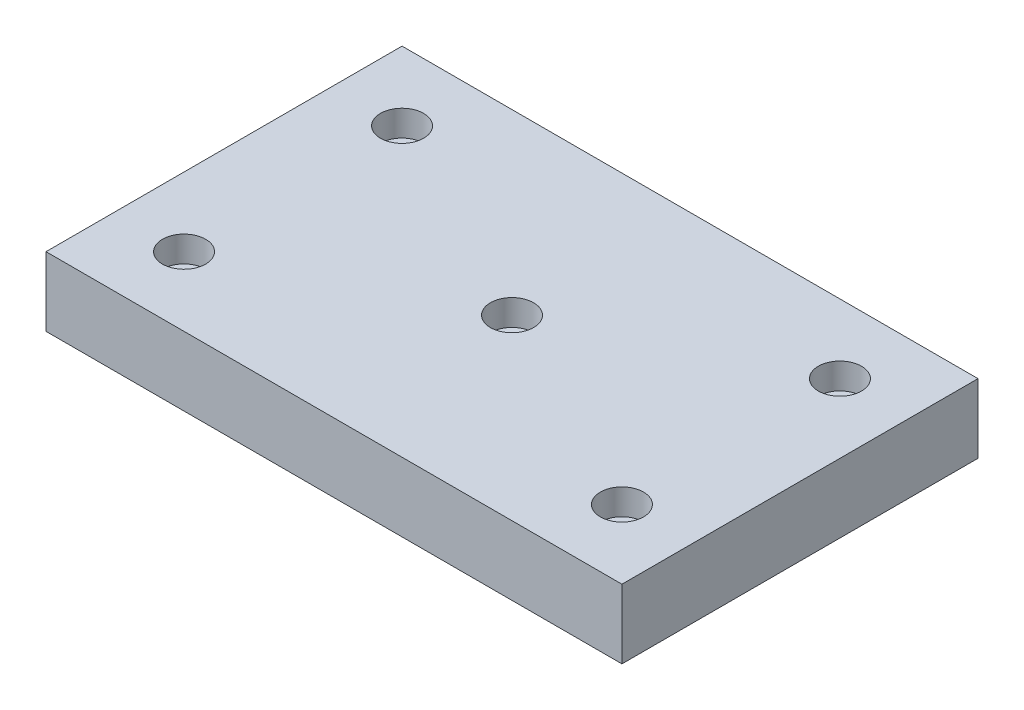
ISO-10303-21;
HEADER;
FILE_DESCRIPTION(('STEP AP214'),'2;1');
FILE_NAME('part.step','',(''),(''),'','','');
FILE_SCHEMA(('AUTOMOTIVE_DESIGN { 1 0 10303 214 1 1 1 1 }'));
ENDSEC;
DATA;
#1=APPLICATION_CONTEXT('core data for automotive mechanical design processes');
#2=APPLICATION_PROTOCOL_DEFINITION('international standard','automotive_design',2000,#1);
#3=PRODUCT_CONTEXT('',#1,'mechanical');
#4=PRODUCT('Part','Part','',(#3));
#5=PRODUCT_RELATED_PRODUCT_CATEGORY('part','',(#4));
#6=PRODUCT_DEFINITION_FORMATION('','',#4);
#7=PRODUCT_DEFINITION_CONTEXT('part definition',#1,'design');
#8=PRODUCT_DEFINITION('design','',#6,#7);
#9=PRODUCT_DEFINITION_SHAPE('','',#8);
#10=(LENGTH_UNIT() NAMED_UNIT(*) SI_UNIT(.MILLI.,.METRE.));
#11=(NAMED_UNIT(*) PLANE_ANGLE_UNIT() SI_UNIT($,.RADIAN.));
#12=(NAMED_UNIT(*) SI_UNIT($,.STERADIAN.) SOLID_ANGLE_UNIT());
#13=UNCERTAINTY_MEASURE_WITH_UNIT(LENGTH_MEASURE(1.E-05),#10,'distance_accuracy_value','');
#14=(GEOMETRIC_REPRESENTATION_CONTEXT(3) GLOBAL_UNCERTAINTY_ASSIGNED_CONTEXT((#13)) GLOBAL_UNIT_ASSIGNED_CONTEXT((#10,
#11,#12)) REPRESENTATION_CONTEXT('',''));
#15=CARTESIAN_POINT('',(0.,0.,0.));
#16=DIRECTION('',(0.,0.,1.));
#17=DIRECTION('',(1.,0.,0.));
#18=AXIS2_PLACEMENT_3D('',#15,#16,#17);
#19=CARTESIAN_POINT('',(105.966303111985,25.4,65.5095196554923));
#20=DIRECTION('',(-1.,0.,0.));
#21=DIRECTION('',(0.,0.,1.));
#22=AXIS2_PLACEMENT_3D('',#19,#20,#21);
#23=PLANE('',#22);
#24=DIRECTION('',(0.,0.,-1.));
#25=VECTOR('',#24,1.);
#26=CARTESIAN_POINT('',(105.966303111985,0.,65.5095196554923));
#27=LINE('',#26,#25);
#28=CARTESIAN_POINT('',(105.966303111985,0.,65.5095196554923));
#29=VERTEX_POINT('',#28);
#30=CARTESIAN_POINT('',(105.966303111985,0.,-65.5095196554923));
#31=VERTEX_POINT('',#30);
#32=EDGE_CURVE('E97',#29,#31,#27,.T.);
#33=ORIENTED_EDGE('',*,*,#32,.T.);
#34=DIRECTION('',(0.,-1.,0.));
#35=VECTOR('',#34,1.);
#36=CARTESIAN_POINT('',(105.966303111985,25.4,-65.5095196554923));
#37=LINE('',#36,#35);
#38=CARTESIAN_POINT('',(105.966303111985,25.4,-65.5095196554923));
#39=VERTEX_POINT('',#38);
#40=EDGE_CURVE('E11',#39,#31,#37,.T.);
#41=ORIENTED_EDGE('',*,*,#40,.F.);
#42=DIRECTION('',(0.,0.,-1.));
#43=VECTOR('',#42,1.);
#44=CARTESIAN_POINT('',(105.966303111985,25.4,65.5095196554923));
#45=LINE('',#44,#43);
#46=CARTESIAN_POINT('',(105.966303111985,25.4,65.5095196554923));
#47=VERTEX_POINT('',#46);
#48=EDGE_CURVE('E85',#47,#39,#45,.T.);
#49=ORIENTED_EDGE('',*,*,#48,.F.);
#50=DIRECTION('',(0.,-1.,0.));
#51=VECTOR('',#50,1.);
#52=CARTESIAN_POINT('',(105.966303111985,25.4,65.5095196554923));
#53=LINE('',#52,#51);
#54=EDGE_CURVE('E93',#47,#29,#53,.T.);
#55=ORIENTED_EDGE('',*,*,#54,.T.);
#56=EDGE_LOOP('',(#33,#41,#49,#55));
#57=FACE_BOUND('',#56,.T.);
#58=ADVANCED_FACE('F34',(#57),#23,.F.);
#59=CARTESIAN_POINT('',(-105.966303111985,25.4,-65.5095196554923));
#60=DIRECTION('',(0.,0.,1.));
#61=DIRECTION('',(1.,0.,0.));
#62=AXIS2_PLACEMENT_3D('',#59,#60,#61);
#63=PLANE('',#62);
#64=DIRECTION('',(-1.,0.,0.));
#65=VECTOR('',#64,1.);
#66=CARTESIAN_POINT('',(-105.966303111985,0.,-65.5095196554923));
#67=LINE('',#66,#65);
#68=CARTESIAN_POINT('',(-105.966303111985,0.,-65.5095196554923));
#69=VERTEX_POINT('',#68);
#70=EDGE_CURVE('E89',#31,#69,#67,.T.);
#71=ORIENTED_EDGE('',*,*,#70,.T.);
#72=DIRECTION('',(0.,-1.,0.));
#73=VECTOR('',#72,1.);
#74=CARTESIAN_POINT('',(-105.966303111985,25.4,-65.5095196554923));
#75=LINE('',#74,#73);
#76=CARTESIAN_POINT('',(-105.966303111985,25.4,-65.5095196554923));
#77=VERTEX_POINT('',#76);
#78=EDGE_CURVE('E42',#77,#69,#75,.T.);
#79=ORIENTED_EDGE('',*,*,#78,.F.);
#80=DIRECTION('',(-1.,0.,0.));
#81=VECTOR('',#80,1.);
#82=CARTESIAN_POINT('',(-105.966303111985,25.4,-65.5095196554923));
#83=LINE('',#82,#81);
#84=EDGE_CURVE('E80',#39,#77,#83,.T.);
#85=ORIENTED_EDGE('',*,*,#84,.F.);
#86=ORIENTED_EDGE('',*,*,#40,.T.);
#87=EDGE_LOOP('',(#71,#79,#85,#86));
#88=FACE_BOUND('',#87,.T.);
#89=ADVANCED_FACE('F88',(#88),#63,.F.);
#90=CARTESIAN_POINT('',(-105.966303111985,25.4,65.5095196554923));
#91=DIRECTION('',(1.,0.,0.));
#92=DIRECTION('',(0.,0.,-1.));
#93=AXIS2_PLACEMENT_3D('',#90,#91,#92);
#94=PLANE('',#93);
#95=DIRECTION('',(0.,0.,1.));
#96=VECTOR('',#95,1.);
#97=CARTESIAN_POINT('',(-105.966303111985,0.,65.5095196554923));
#98=LINE('',#97,#96);
#99=CARTESIAN_POINT('',(-105.966303111985,0.,65.5095196554923));
#100=VERTEX_POINT('',#99);
#101=EDGE_CURVE('E67',#69,#100,#98,.T.);
#102=ORIENTED_EDGE('',*,*,#101,.T.);
#103=DIRECTION('',(0.,-1.,0.));
#104=VECTOR('',#103,1.);
#105=CARTESIAN_POINT('',(-105.966303111985,25.4,65.5095196554923));
#106=LINE('',#105,#104);
#107=CARTESIAN_POINT('',(-105.966303111985,25.4,65.5095196554923));
#108=VERTEX_POINT('',#107);
#109=EDGE_CURVE('E90',#108,#100,#106,.T.);
#110=ORIENTED_EDGE('',*,*,#109,.F.);
#111=DIRECTION('',(0.,0.,1.));
#112=VECTOR('',#111,1.);
#113=CARTESIAN_POINT('',(-105.966303111985,25.4,65.5095196554923));
#114=LINE('',#113,#112);
#115=EDGE_CURVE('E83',#77,#108,#114,.T.);
#116=ORIENTED_EDGE('',*,*,#115,.F.);
#117=ORIENTED_EDGE('',*,*,#78,.T.);
#118=EDGE_LOOP('',(#102,#110,#116,#117));
#119=FACE_BOUND('',#118,.T.);
#120=ADVANCED_FACE('F91',(#119),#94,.F.);
#121=CARTESIAN_POINT('',(-105.966303111985,25.4,65.5095196554923));
#122=DIRECTION('',(0.,0.,-1.));
#123=DIRECTION('',(-1.,0.,0.));
#124=AXIS2_PLACEMENT_3D('',#121,#122,#123);
#125=PLANE('',#124);
#126=DIRECTION('',(1.,0.,0.));
#127=VECTOR('',#126,1.);
#128=CARTESIAN_POINT('',(-105.966303111985,0.,65.5095196554923));
#129=LINE('',#128,#127);
#130=EDGE_CURVE('E73',#100,#29,#129,.T.);
#131=ORIENTED_EDGE('',*,*,#130,.T.);
#132=ORIENTED_EDGE('',*,*,#54,.F.);
#133=DIRECTION('',(1.,0.,0.));
#134=VECTOR('',#133,1.);
#135=CARTESIAN_POINT('',(-105.966303111985,25.4,65.5095196554923));
#136=LINE('',#135,#134);
#137=EDGE_CURVE('E50',#108,#47,#136,.T.);
#138=ORIENTED_EDGE('',*,*,#137,.F.);
#139=ORIENTED_EDGE('',*,*,#109,.T.);
#140=EDGE_LOOP('',(#131,#132,#138,#139));
#141=FACE_BOUND('',#140,.T.);
#142=ADVANCED_FACE('F105',(#141),#125,.F.);
#143=CARTESIAN_POINT('',(0.,25.4,0.));
#144=DIRECTION('',(0.,-1.,0.));
#145=DIRECTION('',(0.,0.,-1.));
#146=AXIS2_PLACEMENT_3D('',#143,#144,#145);
#147=PLANE('',#146);
#148=CARTESIAN_POINT('',(-80.566303111985,25.4,40.1095196554923));
#149=DIRECTION('',(0.,1.,0.));
#150=DIRECTION('',(0.,0.,1.));
#151=AXIS2_PLACEMENT_3D('',#148,#149,#150);
#152=CIRCLE('',#151,7.9375);
#153=CARTESIAN_POINT('',(-80.566303111985,25.4,48.0470196554923));
#154=VERTEX_POINT('',#153);
#155=EDGE_CURVE('E167',#154,#154,#152,.T.);
#156=ORIENTED_EDGE('',*,*,#155,.F.);
#157=EDGE_LOOP('',(#156));
#158=FACE_BOUND('',#157,.T.);
#159=CARTESIAN_POINT('',(-80.566303111985,25.4,-40.1095196554923));
#160=DIRECTION('',(0.,1.,0.));
#161=DIRECTION('',(0.,0.,1.));
#162=AXIS2_PLACEMENT_3D('',#159,#160,#161);
#163=CIRCLE('',#162,7.9375);
#164=CARTESIAN_POINT('',(-80.566303111985,25.4,-32.1720196554923));
#165=VERTEX_POINT('',#164);
#166=EDGE_CURVE('E155',#165,#165,#163,.T.);
#167=ORIENTED_EDGE('',*,*,#166,.F.);
#168=EDGE_LOOP('',(#167));
#169=FACE_BOUND('',#168,.T.);
#170=CARTESIAN_POINT('',(80.566303111985,25.4,-40.1095196554923));
#171=DIRECTION('',(0.,1.,0.));
#172=DIRECTION('',(0.,0.,1.));
#173=AXIS2_PLACEMENT_3D('',#170,#171,#172);
#174=CIRCLE('',#173,7.9375);
#175=CARTESIAN_POINT('',(80.566303111985,25.4,-32.1720196554923));
#176=VERTEX_POINT('',#175);
#177=EDGE_CURVE('E143',#176,#176,#174,.T.);
#178=ORIENTED_EDGE('',*,*,#177,.F.);
#179=EDGE_LOOP('',(#178));
#180=FACE_BOUND('',#179,.T.);
#181=CARTESIAN_POINT('',(80.566303111985,25.4,40.1095196554923));
#182=DIRECTION('',(0.,1.,0.));
#183=DIRECTION('',(0.,0.,1.));
#184=AXIS2_PLACEMENT_3D('',#181,#182,#183);
#185=CIRCLE('',#184,7.9375);
#186=CARTESIAN_POINT('',(80.566303111985,25.4,48.0470196554923));
#187=VERTEX_POINT('',#186);
#188=EDGE_CURVE('E131',#187,#187,#185,.T.);
#189=ORIENTED_EDGE('',*,*,#188,.F.);
#190=EDGE_LOOP('',(#189));
#191=FACE_BOUND('',#190,.T.);
#192=CARTESIAN_POINT('',(0.,25.4,0.));
#193=DIRECTION('',(0.,1.,0.));
#194=DIRECTION('',(0.,0.,1.));
#195=AXIS2_PLACEMENT_3D('',#192,#193,#194);
#196=CIRCLE('',#195,7.9375);
#197=CARTESIAN_POINT('',(0.,25.4,7.9375));
#198=VERTEX_POINT('',#197);
#199=EDGE_CURVE('E119',#198,#198,#196,.T.);
#200=ORIENTED_EDGE('',*,*,#199,.F.);
#201=EDGE_LOOP('',(#200));
#202=FACE_BOUND('',#201,.T.);
#203=ORIENTED_EDGE('',*,*,#48,.T.);
#204=ORIENTED_EDGE('',*,*,#84,.T.);
#205=ORIENTED_EDGE('',*,*,#115,.T.);
#206=ORIENTED_EDGE('',*,*,#137,.T.);
#207=EDGE_LOOP('',(#203,#204,#205,#206));
#208=FACE_BOUND('',#207,.T.);
#209=ADVANCED_FACE('F81',(#158,#169,#180,#191,#202,#208),#147,.F.);
#210=CARTESIAN_POINT('',(0.,0.,0.));
#211=DIRECTION('',(0.,-1.,0.));
#212=DIRECTION('',(0.,0.,-1.));
#213=AXIS2_PLACEMENT_3D('',#210,#211,#212);
#214=PLANE('',#213);
#215=CARTESIAN_POINT('',(-80.566303111985,0.,40.1095196554923));
#216=DIRECTION('',(0.,-1.,0.));
#217=DIRECTION('',(0.,0.,-1.));
#218=AXIS2_PLACEMENT_3D('',#215,#216,#217);
#219=CIRCLE('',#218,5.04189999999999);
#220=CARTESIAN_POINT('',(-80.566303111985,0.,35.0676196554923));
#221=VERTEX_POINT('',#220);
#222=EDGE_CURVE('E158',#221,#221,#219,.T.);
#223=ORIENTED_EDGE('',*,*,#222,.F.);
#224=EDGE_LOOP('',(#223));
#225=FACE_BOUND('',#224,.T.);
#226=CARTESIAN_POINT('',(-80.566303111985,0.,-40.1095196554923));
#227=DIRECTION('',(0.,-1.,0.));
#228=DIRECTION('',(0.,0.,-1.));
#229=AXIS2_PLACEMENT_3D('',#226,#227,#228);
#230=CIRCLE('',#229,5.04189999999999);
#231=CARTESIAN_POINT('',(-80.566303111985,0.,-45.1514196554923));
#232=VERTEX_POINT('',#231);
#233=EDGE_CURVE('E146',#232,#232,#230,.T.);
#234=ORIENTED_EDGE('',*,*,#233,.F.);
#235=EDGE_LOOP('',(#234));
#236=FACE_BOUND('',#235,.T.);
#237=CARTESIAN_POINT('',(80.566303111985,0.,-40.1095196554923));
#238=DIRECTION('',(0.,-1.,0.));
#239=DIRECTION('',(0.,0.,-1.));
#240=AXIS2_PLACEMENT_3D('',#237,#238,#239);
#241=CIRCLE('',#240,5.04189999999999);
#242=CARTESIAN_POINT('',(80.566303111985,0.,-45.1514196554923));
#243=VERTEX_POINT('',#242);
#244=EDGE_CURVE('E134',#243,#243,#241,.T.);
#245=ORIENTED_EDGE('',*,*,#244,.F.);
#246=EDGE_LOOP('',(#245));
#247=FACE_BOUND('',#246,.T.);
#248=CARTESIAN_POINT('',(80.566303111985,0.,40.1095196554923));
#249=DIRECTION('',(0.,-1.,0.));
#250=DIRECTION('',(0.,0.,-1.));
#251=AXIS2_PLACEMENT_3D('',#248,#249,#250);
#252=CIRCLE('',#251,5.04189999999999);
#253=CARTESIAN_POINT('',(80.566303111985,0.,35.0676196554923));
#254=VERTEX_POINT('',#253);
#255=EDGE_CURVE('E122',#254,#254,#252,.T.);
#256=ORIENTED_EDGE('',*,*,#255,.F.);
#257=EDGE_LOOP('',(#256));
#258=FACE_BOUND('',#257,.T.);
#259=CARTESIAN_POINT('',(0.,0.,0.));
#260=DIRECTION('',(0.,-1.,0.));
#261=DIRECTION('',(0.,0.,-1.));
#262=AXIS2_PLACEMENT_3D('',#259,#260,#261);
#263=CIRCLE('',#262,5.04189999999999);
#264=CARTESIAN_POINT('',(0.,0.,-5.04189999999999));
#265=VERTEX_POINT('',#264);
#266=EDGE_CURVE('E100',#265,#265,#263,.T.);
#267=ORIENTED_EDGE('',*,*,#266,.F.);
#268=EDGE_LOOP('',(#267));
#269=FACE_BOUND('',#268,.T.);
#270=ORIENTED_EDGE('',*,*,#32,.F.);
#271=ORIENTED_EDGE('',*,*,#130,.F.);
#272=ORIENTED_EDGE('',*,*,#101,.F.);
#273=ORIENTED_EDGE('',*,*,#70,.F.);
#274=EDGE_LOOP('',(#270,#271,#272,#273));
#275=FACE_BOUND('',#274,.T.);
#276=ADVANCED_FACE('F108',(#225,#236,#247,#258,#269,#275),#214,.T.);
#277=CARTESIAN_POINT('',(0.,25.4,0.));
#278=DIRECTION('',(0.,1.,0.));
#279=DIRECTION('',(0.,0.,1.));
#280=AXIS2_PLACEMENT_3D('',#277,#278,#279);
#281=CYLINDRICAL_SURFACE('',#280,5.04189999999999);
#282=CARTESIAN_POINT('',(0.,15.875,0.));
#283=DIRECTION('',(0.,1.,0.));
#284=DIRECTION('',(0.,0.,1.));
#285=AXIS2_PLACEMENT_3D('',#282,#283,#284);
#286=CIRCLE('',#285,5.0419);
#287=CARTESIAN_POINT('',(0.,15.875,5.0419));
#288=VERTEX_POINT('',#287);
#289=EDGE_CURVE('E113',#288,#288,#286,.T.);
#290=ORIENTED_EDGE('',*,*,#289,.T.);
#291=EDGE_LOOP('',(#290));
#292=FACE_BOUND('',#291,.T.);
#293=ORIENTED_EDGE('',*,*,#266,.T.);
#294=EDGE_LOOP('',(#293));
#295=FACE_BOUND('',#294,.T.);
#296=ADVANCED_FACE('F197',(#292,#295),#281,.F.);
#297=CARTESIAN_POINT('',(5.0419,15.875,0.));
#298=DIRECTION('',(0.,-1.,0.));
#299=DIRECTION('',(0.,0.,-1.));
#300=AXIS2_PLACEMENT_3D('',#297,#298,#299);
#301=PLANE('',#300);
#302=ORIENTED_EDGE('',*,*,#289,.F.);
#303=EDGE_LOOP('',(#302));
#304=FACE_BOUND('',#303,.T.);
#305=CARTESIAN_POINT('',(0.,15.875,0.));
#306=DIRECTION('',(0.,1.,0.));
#307=DIRECTION('',(0.,0.,1.));
#308=AXIS2_PLACEMENT_3D('',#305,#306,#307);
#309=CIRCLE('',#308,7.9375);
#310=CARTESIAN_POINT('',(0.,15.875,7.9375));
#311=VERTEX_POINT('',#310);
#312=EDGE_CURVE('E116',#311,#311,#309,.T.);
#313=ORIENTED_EDGE('',*,*,#312,.T.);
#314=EDGE_LOOP('',(#313));
#315=FACE_BOUND('',#314,.T.);
#316=ADVANCED_FACE('F187',(#304,#315),#301,.F.);
#317=CARTESIAN_POINT('',(0.,25.4,0.));
#318=DIRECTION('',(0.,1.,0.));
#319=DIRECTION('',(0.,0.,1.));
#320=AXIS2_PLACEMENT_3D('',#317,#318,#319);
#321=CYLINDRICAL_SURFACE('',#320,7.9375);
#322=ORIENTED_EDGE('',*,*,#312,.F.);
#323=EDGE_LOOP('',(#322));
#324=FACE_BOUND('',#323,.T.);
#325=ORIENTED_EDGE('',*,*,#199,.T.);
#326=EDGE_LOOP('',(#325));
#327=FACE_BOUND('',#326,.T.);
#328=ADVANCED_FACE('F184',(#324,#327),#321,.F.);
#329=CARTESIAN_POINT('',(80.566303111985,25.4,40.1095196554923));
#330=DIRECTION('',(0.,1.,0.));
#331=DIRECTION('',(0.,0.,1.));
#332=AXIS2_PLACEMENT_3D('',#329,#330,#331);
#333=CYLINDRICAL_SURFACE('',#332,5.04189999999999);
#334=CARTESIAN_POINT('',(80.566303111985,15.875,40.1095196554923));
#335=DIRECTION('',(0.,1.,0.));
#336=DIRECTION('',(0.,0.,1.));
#337=AXIS2_PLACEMENT_3D('',#334,#335,#336);
#338=CIRCLE('',#337,5.0419);
#339=CARTESIAN_POINT('',(80.566303111985,15.875,45.1514196554923));
#340=VERTEX_POINT('',#339);
#341=EDGE_CURVE('E125',#340,#340,#338,.T.);
#342=ORIENTED_EDGE('',*,*,#341,.T.);
#343=EDGE_LOOP('',(#342));
#344=FACE_BOUND('',#343,.T.);
#345=ORIENTED_EDGE('',*,*,#255,.T.);
#346=EDGE_LOOP('',(#345));
#347=FACE_BOUND('',#346,.T.);
#348=ADVANCED_FACE('F186',(#344,#347),#333,.F.);
#349=CARTESIAN_POINT('',(85.608203111985,15.875,40.1095196554923));
#350=DIRECTION('',(0.,-1.,0.));
#351=DIRECTION('',(0.,0.,-1.));
#352=AXIS2_PLACEMENT_3D('',#349,#350,#351);
#353=PLANE('',#352);
#354=ORIENTED_EDGE('',*,*,#341,.F.);
#355=EDGE_LOOP('',(#354));
#356=FACE_BOUND('',#355,.T.);
#357=CARTESIAN_POINT('',(80.566303111985,15.875,40.1095196554923));
#358=DIRECTION('',(0.,1.,0.));
#359=DIRECTION('',(0.,0.,1.));
#360=AXIS2_PLACEMENT_3D('',#357,#358,#359);
#361=CIRCLE('',#360,7.9375);
#362=CARTESIAN_POINT('',(80.566303111985,15.875,48.0470196554923));
#363=VERTEX_POINT('',#362);
#364=EDGE_CURVE('E128',#363,#363,#361,.T.);
#365=ORIENTED_EDGE('',*,*,#364,.T.);
#366=EDGE_LOOP('',(#365));
#367=FACE_BOUND('',#366,.T.);
#368=ADVANCED_FACE('F194',(#356,#367),#353,.F.);
#369=CARTESIAN_POINT('',(80.566303111985,25.4,40.1095196554923));
#370=DIRECTION('',(0.,1.,0.));
#371=DIRECTION('',(0.,0.,1.));
#372=AXIS2_PLACEMENT_3D('',#369,#370,#371);
#373=CYLINDRICAL_SURFACE('',#372,7.9375);
#374=ORIENTED_EDGE('',*,*,#364,.F.);
#375=EDGE_LOOP('',(#374));
#376=FACE_BOUND('',#375,.T.);
#377=ORIENTED_EDGE('',*,*,#188,.T.);
#378=EDGE_LOOP('',(#377));
#379=FACE_BOUND('',#378,.T.);
#380=ADVANCED_FACE('F249',(#376,#379),#373,.F.);
#381=CARTESIAN_POINT('',(80.566303111985,25.4,-40.1095196554923));
#382=DIRECTION('',(0.,1.,0.));
#383=DIRECTION('',(0.,0.,1.));
#384=AXIS2_PLACEMENT_3D('',#381,#382,#383);
#385=CYLINDRICAL_SURFACE('',#384,5.04189999999999);
#386=CARTESIAN_POINT('',(80.566303111985,15.875,-40.1095196554923));
#387=DIRECTION('',(0.,1.,0.));
#388=DIRECTION('',(0.,0.,1.));
#389=AXIS2_PLACEMENT_3D('',#386,#387,#388);
#390=CIRCLE('',#389,5.0419);
#391=CARTESIAN_POINT('',(80.566303111985,15.875,-35.0676196554923));
#392=VERTEX_POINT('',#391);
#393=EDGE_CURVE('E137',#392,#392,#390,.T.);
#394=ORIENTED_EDGE('',*,*,#393,.T.);
#395=EDGE_LOOP('',(#394));
#396=FACE_BOUND('',#395,.T.);
#397=ORIENTED_EDGE('',*,*,#244,.T.);
#398=EDGE_LOOP('',(#397));
#399=FACE_BOUND('',#398,.T.);
#400=ADVANCED_FACE('F259',(#396,#399),#385,.F.);
#401=CARTESIAN_POINT('',(85.608203111985,15.875,-40.1095196554923));
#402=DIRECTION('',(0.,-1.,0.));
#403=DIRECTION('',(0.,0.,-1.));
#404=AXIS2_PLACEMENT_3D('',#401,#402,#403);
#405=PLANE('',#404);
#406=ORIENTED_EDGE('',*,*,#393,.F.);
#407=EDGE_LOOP('',(#406));
#408=FACE_BOUND('',#407,.T.);
#409=CARTESIAN_POINT('',(80.566303111985,15.875,-40.1095196554923));
#410=DIRECTION('',(0.,1.,0.));
#411=DIRECTION('',(0.,0.,1.));
#412=AXIS2_PLACEMENT_3D('',#409,#410,#411);
#413=CIRCLE('',#412,7.9375);
#414=CARTESIAN_POINT('',(80.566303111985,15.875,-32.1720196554923));
#415=VERTEX_POINT('',#414);
#416=EDGE_CURVE('E140',#415,#415,#413,.T.);
#417=ORIENTED_EDGE('',*,*,#416,.T.);
#418=EDGE_LOOP('',(#417));
#419=FACE_BOUND('',#418,.T.);
#420=ADVANCED_FACE('F269',(#408,#419),#405,.F.);
#421=CARTESIAN_POINT('',(80.566303111985,25.4,-40.1095196554923));
#422=DIRECTION('',(0.,1.,0.));
#423=DIRECTION('',(0.,0.,1.));
#424=AXIS2_PLACEMENT_3D('',#421,#422,#423);
#425=CYLINDRICAL_SURFACE('',#424,7.9375);
#426=ORIENTED_EDGE('',*,*,#416,.F.);
#427=EDGE_LOOP('',(#426));
#428=FACE_BOUND('',#427,.T.);
#429=ORIENTED_EDGE('',*,*,#177,.T.);
#430=EDGE_LOOP('',(#429));
#431=FACE_BOUND('',#430,.T.);
#432=ADVANCED_FACE('F279',(#428,#431),#425,.F.);
#433=CARTESIAN_POINT('',(-80.566303111985,25.4,-40.1095196554923));
#434=DIRECTION('',(0.,1.,0.));
#435=DIRECTION('',(0.,0.,1.));
#436=AXIS2_PLACEMENT_3D('',#433,#434,#435);
#437=CYLINDRICAL_SURFACE('',#436,5.04189999999999);
#438=CARTESIAN_POINT('',(-80.566303111985,15.875,-40.1095196554923));
#439=DIRECTION('',(0.,1.,0.));
#440=DIRECTION('',(0.,0.,1.));
#441=AXIS2_PLACEMENT_3D('',#438,#439,#440);
#442=CIRCLE('',#441,5.0419);
#443=CARTESIAN_POINT('',(-80.566303111985,15.875,-35.0676196554923));
#444=VERTEX_POINT('',#443);
#445=EDGE_CURVE('E149',#444,#444,#442,.T.);
#446=ORIENTED_EDGE('',*,*,#445,.T.);
#447=EDGE_LOOP('',(#446));
#448=FACE_BOUND('',#447,.T.);
#449=ORIENTED_EDGE('',*,*,#233,.T.);
#450=EDGE_LOOP('',(#449));
#451=FACE_BOUND('',#450,.T.);
#452=ADVANCED_FACE('F289',(#448,#451),#437,.F.);
#453=CARTESIAN_POINT('',(-75.524403111985,15.875,-40.1095196554923));
#454=DIRECTION('',(0.,-1.,0.));
#455=DIRECTION('',(0.,0.,-1.));
#456=AXIS2_PLACEMENT_3D('',#453,#454,#455);
#457=PLANE('',#456);
#458=ORIENTED_EDGE('',*,*,#445,.F.);
#459=EDGE_LOOP('',(#458));
#460=FACE_BOUND('',#459,.T.);
#461=CARTESIAN_POINT('',(-80.566303111985,15.875,-40.1095196554923));
#462=DIRECTION('',(0.,1.,0.));
#463=DIRECTION('',(0.,0.,1.));
#464=AXIS2_PLACEMENT_3D('',#461,#462,#463);
#465=CIRCLE('',#464,7.9375);
#466=CARTESIAN_POINT('',(-80.566303111985,15.875,-32.1720196554923));
#467=VERTEX_POINT('',#466);
#468=EDGE_CURVE('E152',#467,#467,#465,.T.);
#469=ORIENTED_EDGE('',*,*,#468,.T.);
#470=EDGE_LOOP('',(#469));
#471=FACE_BOUND('',#470,.T.);
#472=ADVANCED_FACE('F299',(#460,#471),#457,.F.);
#473=CARTESIAN_POINT('',(-80.566303111985,25.4,-40.1095196554923));
#474=DIRECTION('',(0.,1.,0.));
#475=DIRECTION('',(0.,0.,1.));
#476=AXIS2_PLACEMENT_3D('',#473,#474,#475);
#477=CYLINDRICAL_SURFACE('',#476,7.9375);
#478=ORIENTED_EDGE('',*,*,#468,.F.);
#479=EDGE_LOOP('',(#478));
#480=FACE_BOUND('',#479,.T.);
#481=ORIENTED_EDGE('',*,*,#166,.T.);
#482=EDGE_LOOP('',(#481));
#483=FACE_BOUND('',#482,.T.);
#484=ADVANCED_FACE('F309',(#480,#483),#477,.F.);
#485=CARTESIAN_POINT('',(-80.566303111985,25.4,40.1095196554923));
#486=DIRECTION('',(0.,1.,0.));
#487=DIRECTION('',(0.,0.,1.));
#488=AXIS2_PLACEMENT_3D('',#485,#486,#487);
#489=CYLINDRICAL_SURFACE('',#488,5.04189999999999);
#490=CARTESIAN_POINT('',(-80.566303111985,15.875,40.1095196554923));
#491=DIRECTION('',(0.,1.,0.));
#492=DIRECTION('',(0.,0.,1.));
#493=AXIS2_PLACEMENT_3D('',#490,#491,#492);
#494=CIRCLE('',#493,5.0419);
#495=CARTESIAN_POINT('',(-80.566303111985,15.875,45.1514196554923));
#496=VERTEX_POINT('',#495);
#497=EDGE_CURVE('E161',#496,#496,#494,.T.);
#498=ORIENTED_EDGE('',*,*,#497,.T.);
#499=EDGE_LOOP('',(#498));
#500=FACE_BOUND('',#499,.T.);
#501=ORIENTED_EDGE('',*,*,#222,.T.);
#502=EDGE_LOOP('',(#501));
#503=FACE_BOUND('',#502,.T.);
#504=ADVANCED_FACE('F319',(#500,#503),#489,.F.);
#505=CARTESIAN_POINT('',(-75.524403111985,15.875,40.1095196554923));
#506=DIRECTION('',(0.,-1.,0.));
#507=DIRECTION('',(0.,0.,-1.));
#508=AXIS2_PLACEMENT_3D('',#505,#506,#507);
#509=PLANE('',#508);
#510=ORIENTED_EDGE('',*,*,#497,.F.);
#511=EDGE_LOOP('',(#510));
#512=FACE_BOUND('',#511,.T.);
#513=CARTESIAN_POINT('',(-80.566303111985,15.875,40.1095196554923));
#514=DIRECTION('',(0.,1.,0.));
#515=DIRECTION('',(0.,0.,1.));
#516=AXIS2_PLACEMENT_3D('',#513,#514,#515);
#517=CIRCLE('',#516,7.9375);
#518=CARTESIAN_POINT('',(-80.566303111985,15.875,48.0470196554923));
#519=VERTEX_POINT('',#518);
#520=EDGE_CURVE('E164',#519,#519,#517,.T.);
#521=ORIENTED_EDGE('',*,*,#520,.T.);
#522=EDGE_LOOP('',(#521));
#523=FACE_BOUND('',#522,.T.);
#524=ADVANCED_FACE('F329',(#512,#523),#509,.F.);
#525=CARTESIAN_POINT('',(-80.566303111985,25.4,40.1095196554923));
#526=DIRECTION('',(0.,1.,0.));
#527=DIRECTION('',(0.,0.,1.));
#528=AXIS2_PLACEMENT_3D('',#525,#526,#527);
#529=CYLINDRICAL_SURFACE('',#528,7.9375);
#530=ORIENTED_EDGE('',*,*,#520,.F.);
#531=EDGE_LOOP('',(#530));
#532=FACE_BOUND('',#531,.T.);
#533=ORIENTED_EDGE('',*,*,#155,.T.);
#534=EDGE_LOOP('',(#533));
#535=FACE_BOUND('',#534,.T.);
#536=ADVANCED_FACE('F171',(#532,#535),#529,.F.);
#537=CLOSED_SHELL('',(#58,#89,#120,#142,#209,#276,#296,#316,#328,#348,#368,#380,#400,#420,#432,
#452,#472,#484,#504,#524,#536));
#538=MANIFOLD_SOLID_BREP('B2',#537);
#539=ADVANCED_BREP_SHAPE_REPRESENTATION('',(#18,#538),#14);
#540=SHAPE_DEFINITION_REPRESENTATION(#9,#539);
ENDSEC;
END-ISO-10303-21;
